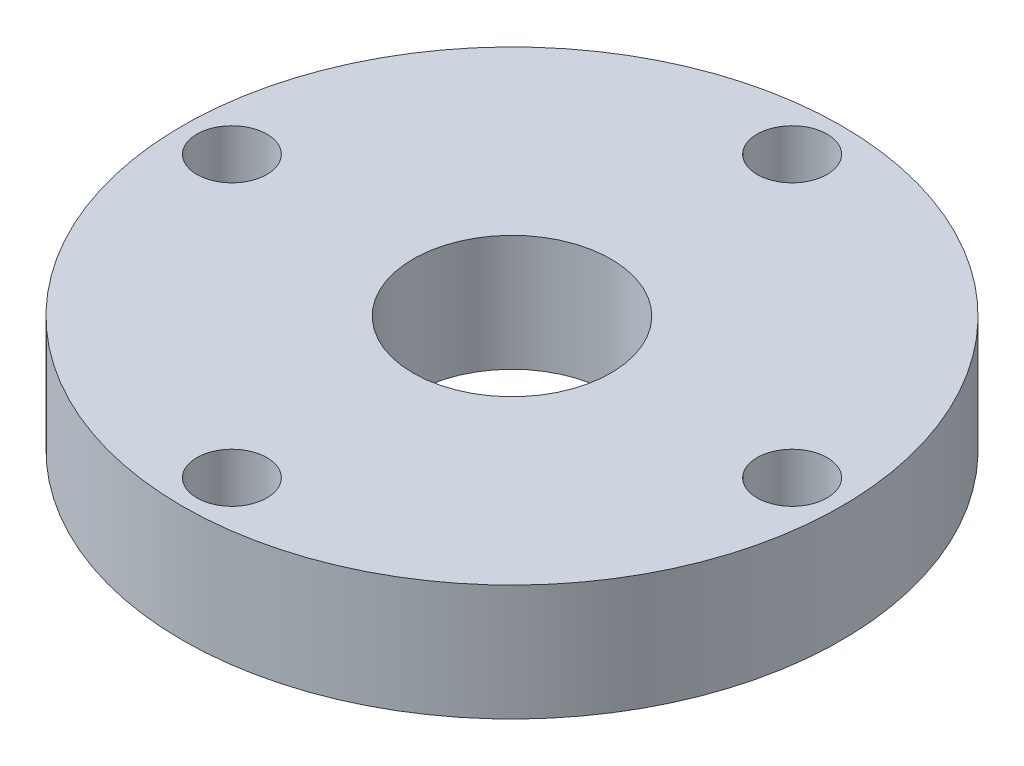
ISO-10303-21;
HEADER;
FILE_DESCRIPTION(('STEP AP214'),'2;1');
FILE_NAME('part.step','',(''),(''),'','','');
FILE_SCHEMA(('AUTOMOTIVE_DESIGN { 1 0 10303 214 1 1 1 1 }'));
ENDSEC;
DATA;
#1=APPLICATION_CONTEXT('core data for automotive mechanical design processes');
#2=APPLICATION_PROTOCOL_DEFINITION('international standard','automotive_design',2000,#1);
#3=PRODUCT_CONTEXT('',#1,'mechanical');
#4=PRODUCT('Part','Part','',(#3));
#5=PRODUCT_RELATED_PRODUCT_CATEGORY('part','',(#4));
#6=PRODUCT_DEFINITION_FORMATION('','',#4);
#7=PRODUCT_DEFINITION_CONTEXT('part definition',#1,'design');
#8=PRODUCT_DEFINITION('design','',#6,#7);
#9=PRODUCT_DEFINITION_SHAPE('','',#8);
#10=(LENGTH_UNIT() NAMED_UNIT(*) SI_UNIT(.MILLI.,.METRE.));
#11=(NAMED_UNIT(*) PLANE_ANGLE_UNIT() SI_UNIT($,.RADIAN.));
#12=(NAMED_UNIT(*) SI_UNIT($,.STERADIAN.) SOLID_ANGLE_UNIT());
#13=UNCERTAINTY_MEASURE_WITH_UNIT(LENGTH_MEASURE(1.E-05),#10,'distance_accuracy_value','');
#14=(GEOMETRIC_REPRESENTATION_CONTEXT(3) GLOBAL_UNCERTAINTY_ASSIGNED_CONTEXT((#13)) GLOBAL_UNIT_ASSIGNED_CONTEXT((#10,
#11,#12)) REPRESENTATION_CONTEXT('',''));
#15=CARTESIAN_POINT('',(0.,0.,0.));
#16=DIRECTION('',(0.,0.,1.));
#17=DIRECTION('',(1.,0.,0.));
#18=AXIS2_PLACEMENT_3D('',#15,#16,#17);
#19=CARTESIAN_POINT('',(0.,-11.176,0.));
#20=DIRECTION('',(0.,1.,0.));
#21=DIRECTION('',(0.,0.,1.));
#22=AXIS2_PLACEMENT_3D('',#19,#20,#21);
#23=PLANE('',#22);
#24=CARTESIAN_POINT('',(0.,-11.176,53.975));
#25=DIRECTION('',(0.,1.,0.));
#26=DIRECTION('',(0.,0.,1.));
#27=AXIS2_PLACEMENT_3D('',#24,#25,#26);
#28=CIRCLE('',#27,4.36879999999999);
#29=CARTESIAN_POINT('',(0.,-11.176,58.3438));
#30=VERTEX_POINT('',#29);
#31=EDGE_CURVE('E96',#30,#30,#28,.T.);
#32=ORIENTED_EDGE('',*,*,#31,.T.);
#33=EDGE_LOOP('',(#32));
#34=FACE_BOUND('',#33,.T.);
#35=CARTESIAN_POINT('',(53.975,-11.176,0.));
#36=DIRECTION('',(0.,1.,0.));
#37=DIRECTION('',(0.,0.,1.));
#38=AXIS2_PLACEMENT_3D('',#35,#36,#37);
#39=CIRCLE('',#38,4.36879999999999);
#40=CARTESIAN_POINT('',(53.975,-11.176,4.36879999999999));
#41=VERTEX_POINT('',#40);
#42=EDGE_CURVE('E84',#41,#41,#39,.T.);
#43=ORIENTED_EDGE('',*,*,#42,.T.);
#44=EDGE_LOOP('',(#43));
#45=FACE_BOUND('',#44,.T.);
#46=CARTESIAN_POINT('',(0.,-11.176,-53.975));
#47=DIRECTION('',(0.,1.,0.));
#48=DIRECTION('',(0.,0.,1.));
#49=AXIS2_PLACEMENT_3D('',#46,#47,#48);
#50=CIRCLE('',#49,4.36879999999999);
#51=CARTESIAN_POINT('',(0.,-11.176,-49.6062));
#52=VERTEX_POINT('',#51);
#53=EDGE_CURVE('E72',#52,#52,#50,.T.);
#54=ORIENTED_EDGE('',*,*,#53,.T.);
#55=EDGE_LOOP('',(#54));
#56=FACE_BOUND('',#55,.T.);
#57=CARTESIAN_POINT('',(-53.975,-11.176,0.));
#58=DIRECTION('',(0.,1.,0.));
#59=DIRECTION('',(0.,0.,1.));
#60=AXIS2_PLACEMENT_3D('',#57,#58,#59);
#61=CIRCLE('',#60,4.36879999999999);
#62=CARTESIAN_POINT('',(-53.975,-11.176,4.36879999999999));
#63=VERTEX_POINT('',#62);
#64=EDGE_CURVE('E59',#63,#63,#61,.T.);
#65=ORIENTED_EDGE('',*,*,#64,.T.);
#66=EDGE_LOOP('',(#65));
#67=FACE_BOUND('',#66,.T.);
#68=CARTESIAN_POINT('',(0.,-11.176,0.));
#69=DIRECTION('',(0.,1.,0.));
#70=DIRECTION('',(0.,0.,1.));
#71=AXIS2_PLACEMENT_3D('',#68,#69,#70);
#72=CIRCLE('',#71,19.05);
#73=CARTESIAN_POINT('',(0.,-11.176,19.05));
#74=VERTEX_POINT('',#73);
#75=EDGE_CURVE('E51',#74,#74,#72,.T.);
#76=ORIENTED_EDGE('',*,*,#75,.T.);
#77=EDGE_LOOP('',(#76));
#78=FACE_BOUND('',#77,.T.);
#79=CARTESIAN_POINT('',(0.,-11.176,0.));
#80=DIRECTION('',(0.,-1.,0.));
#81=DIRECTION('',(0.,0.,-1.));
#82=AXIS2_PLACEMENT_3D('',#79,#80,#81);
#83=CIRCLE('',#82,63.5);
#84=CARTESIAN_POINT('',(0.,-11.176,-63.5));
#85=VERTEX_POINT('',#84);
#86=EDGE_CURVE('E10',#85,#85,#83,.T.);
#87=ORIENTED_EDGE('',*,*,#86,.T.);
#88=EDGE_LOOP('',(#87));
#89=FACE_BOUND('',#88,.T.);
#90=ADVANCED_FACE('F41',(#34,#45,#56,#67,#78,#89),#23,.F.);
#91=CARTESIAN_POINT('',(0.,-36.576,0.));
#92=DIRECTION('',(0.,-1.,0.));
#93=DIRECTION('',(0.,0.,-1.));
#94=AXIS2_PLACEMENT_3D('',#91,#92,#93);
#95=CYLINDRICAL_SURFACE('',#94,63.5);
#96=ORIENTED_EDGE('',*,*,#86,.F.);
#97=EDGE_LOOP('',(#96));
#98=FACE_BOUND('',#97,.T.);
#99=CARTESIAN_POINT('',(0.,11.176,0.));
#100=DIRECTION('',(0.,-1.,0.));
#101=DIRECTION('',(0.,0.,-1.));
#102=AXIS2_PLACEMENT_3D('',#99,#100,#101);
#103=CIRCLE('',#102,63.5);
#104=CARTESIAN_POINT('',(0.,11.176,-63.5));
#105=VERTEX_POINT('',#104);
#106=EDGE_CURVE('E47',#105,#105,#103,.T.);
#107=ORIENTED_EDGE('',*,*,#106,.T.);
#108=EDGE_LOOP('',(#107));
#109=FACE_BOUND('',#108,.T.);
#110=ADVANCED_FACE('F115',(#98,#109),#95,.T.);
#111=CARTESIAN_POINT('',(-63.5,11.176,0.));
#112=DIRECTION('',(0.,-1.,0.));
#113=DIRECTION('',(0.,0.,-1.));
#114=AXIS2_PLACEMENT_3D('',#111,#112,#113);
#115=PLANE('',#114);
#116=CARTESIAN_POINT('',(0.,11.176,53.975));
#117=DIRECTION('',(0.,1.,0.));
#118=DIRECTION('',(0.,0.,1.));
#119=AXIS2_PLACEMENT_3D('',#116,#117,#118);
#120=CIRCLE('',#119,6.7437);
#121=CARTESIAN_POINT('',(0.,11.176,60.7187));
#122=VERTEX_POINT('',#121);
#123=EDGE_CURVE('E105',#122,#122,#120,.T.);
#124=ORIENTED_EDGE('',*,*,#123,.F.);
#125=EDGE_LOOP('',(#124));
#126=FACE_BOUND('',#125,.T.);
#127=CARTESIAN_POINT('',(53.975,11.176,0.));
#128=DIRECTION('',(0.,1.,0.));
#129=DIRECTION('',(0.,0.,1.));
#130=AXIS2_PLACEMENT_3D('',#127,#128,#129);
#131=CIRCLE('',#130,6.74369999999999);
#132=CARTESIAN_POINT('',(53.975,11.176,6.74369999999999));
#133=VERTEX_POINT('',#132);
#134=EDGE_CURVE('E93',#133,#133,#131,.T.);
#135=ORIENTED_EDGE('',*,*,#134,.F.);
#136=EDGE_LOOP('',(#135));
#137=FACE_BOUND('',#136,.T.);
#138=CARTESIAN_POINT('',(0.,11.176,-53.975));
#139=DIRECTION('',(0.,1.,0.));
#140=DIRECTION('',(0.,0.,1.));
#141=AXIS2_PLACEMENT_3D('',#138,#139,#140);
#142=CIRCLE('',#141,6.7437);
#143=CARTESIAN_POINT('',(0.,11.176,-47.2313));
#144=VERTEX_POINT('',#143);
#145=EDGE_CURVE('E81',#144,#144,#142,.T.);
#146=ORIENTED_EDGE('',*,*,#145,.F.);
#147=EDGE_LOOP('',(#146));
#148=FACE_BOUND('',#147,.T.);
#149=CARTESIAN_POINT('',(-53.975,11.176,0.));
#150=DIRECTION('',(0.,1.,0.));
#151=DIRECTION('',(0.,0.,1.));
#152=AXIS2_PLACEMENT_3D('',#149,#150,#151);
#153=CIRCLE('',#152,6.74369999999999);
#154=CARTESIAN_POINT('',(-53.975,11.176,6.74369999999999));
#155=VERTEX_POINT('',#154);
#156=EDGE_CURVE('E69',#155,#155,#153,.T.);
#157=ORIENTED_EDGE('',*,*,#156,.F.);
#158=EDGE_LOOP('',(#157));
#159=FACE_BOUND('',#158,.T.);
#160=CARTESIAN_POINT('',(0.,11.176,0.));
#161=DIRECTION('',(0.,1.,0.));
#162=DIRECTION('',(0.,0.,1.));
#163=AXIS2_PLACEMENT_3D('',#160,#161,#162);
#164=CIRCLE('',#163,19.05);
#165=CARTESIAN_POINT('',(0.,11.176,19.05));
#166=VERTEX_POINT('',#165);
#167=EDGE_CURVE('E55',#166,#166,#164,.T.);
#168=ORIENTED_EDGE('',*,*,#167,.F.);
#169=EDGE_LOOP('',(#168));
#170=FACE_BOUND('',#169,.T.);
#171=ORIENTED_EDGE('',*,*,#106,.F.);
#172=EDGE_LOOP('',(#171));
#173=FACE_BOUND('',#172,.T.);
#174=ADVANCED_FACE('F111',(#126,#137,#148,#159,#170,#173),#115,.F.);
#175=CARTESIAN_POINT('',(0.,-11.176,0.));
#176=DIRECTION('',(0.,1.,0.));
#177=DIRECTION('',(0.,0.,1.));
#178=AXIS2_PLACEMENT_3D('',#175,#176,#177);
#179=CYLINDRICAL_SURFACE('',#178,19.05);
#180=ORIENTED_EDGE('',*,*,#75,.F.);
#181=EDGE_LOOP('',(#180));
#182=FACE_BOUND('',#181,.T.);
#183=ORIENTED_EDGE('',*,*,#167,.T.);
#184=EDGE_LOOP('',(#183));
#185=FACE_BOUND('',#184,.T.);
#186=ADVANCED_FACE('F114',(#182,#185),#179,.F.);
#187=CARTESIAN_POINT('',(-53.975,11.176,0.));
#188=DIRECTION('',(0.,1.,0.));
#189=DIRECTION('',(0.,0.,1.));
#190=AXIS2_PLACEMENT_3D('',#187,#188,#189);
#191=CYLINDRICAL_SURFACE('',#190,4.36879999999999);
#192=ORIENTED_EDGE('',*,*,#64,.F.);
#193=EDGE_LOOP('',(#192));
#194=FACE_BOUND('',#193,.T.);
#195=CARTESIAN_POINT('',(-53.975,1.52400000000001,0.));
#196=DIRECTION('',(0.,1.,0.));
#197=DIRECTION('',(0.,0.,1.));
#198=AXIS2_PLACEMENT_3D('',#195,#196,#197);
#199=CIRCLE('',#198,4.36879999999999);
#200=CARTESIAN_POINT('',(-53.975,1.52400000000001,4.36879999999999));
#201=VERTEX_POINT('',#200);
#202=EDGE_CURVE('E63',#201,#201,#199,.T.);
#203=ORIENTED_EDGE('',*,*,#202,.T.);
#204=EDGE_LOOP('',(#203));
#205=FACE_BOUND('',#204,.T.);
#206=ADVANCED_FACE('F127',(#194,#205),#191,.F.);
#207=CARTESIAN_POINT('',(-49.6062,1.524,0.));
#208=DIRECTION('',(0.,-1.,0.));
#209=DIRECTION('',(0.,0.,-1.));
#210=AXIS2_PLACEMENT_3D('',#207,#208,#209);
#211=PLANE('',#210);
#212=ORIENTED_EDGE('',*,*,#202,.F.);
#213=EDGE_LOOP('',(#212));
#214=FACE_BOUND('',#213,.T.);
#215=CARTESIAN_POINT('',(-53.975,1.524,0.));
#216=DIRECTION('',(0.,1.,0.));
#217=DIRECTION('',(0.,0.,1.));
#218=AXIS2_PLACEMENT_3D('',#215,#216,#217);
#219=CIRCLE('',#218,6.74369999999999);
#220=CARTESIAN_POINT('',(-53.975,1.524,6.74369999999999));
#221=VERTEX_POINT('',#220);
#222=EDGE_CURVE('E66',#221,#221,#219,.T.);
#223=ORIENTED_EDGE('',*,*,#222,.T.);
#224=EDGE_LOOP('',(#223));
#225=FACE_BOUND('',#224,.T.);
#226=ADVANCED_FACE('F134',(#214,#225),#211,.F.);
#227=CARTESIAN_POINT('',(-53.975,11.176,0.));
#228=DIRECTION('',(0.,1.,0.));
#229=DIRECTION('',(0.,0.,1.));
#230=AXIS2_PLACEMENT_3D('',#227,#228,#229);
#231=CYLINDRICAL_SURFACE('',#230,6.74369999999999);
#232=ORIENTED_EDGE('',*,*,#222,.F.);
#233=EDGE_LOOP('',(#232));
#234=FACE_BOUND('',#233,.T.);
#235=ORIENTED_EDGE('',*,*,#156,.T.);
#236=EDGE_LOOP('',(#235));
#237=FACE_BOUND('',#236,.T.);
#238=ADVANCED_FACE('F157',(#234,#237),#231,.F.);
#239=CARTESIAN_POINT('',(0.,11.176,-53.975));
#240=DIRECTION('',(0.,1.,0.));
#241=DIRECTION('',(0.,0.,1.));
#242=AXIS2_PLACEMENT_3D('',#239,#240,#241);
#243=CYLINDRICAL_SURFACE('',#242,4.36879999999999);
#244=ORIENTED_EDGE('',*,*,#53,.F.);
#245=EDGE_LOOP('',(#244));
#246=FACE_BOUND('',#245,.T.);
#247=CARTESIAN_POINT('',(0.,1.52400000000001,-53.975));
#248=DIRECTION('',(0.,1.,0.));
#249=DIRECTION('',(0.,0.,1.));
#250=AXIS2_PLACEMENT_3D('',#247,#248,#249);
#251=CIRCLE('',#250,4.36879999999999);
#252=CARTESIAN_POINT('',(0.,1.52400000000001,-49.6062));
#253=VERTEX_POINT('',#252);
#254=EDGE_CURVE('E75',#253,#253,#251,.T.);
#255=ORIENTED_EDGE('',*,*,#254,.T.);
#256=EDGE_LOOP('',(#255));
#257=FACE_BOUND('',#256,.T.);
#258=ADVANCED_FACE('F162',(#246,#257),#243,.F.);
#259=CARTESIAN_POINT('',(4.36879999999999,1.524,-53.975));
#260=DIRECTION('',(0.,-1.,0.));
#261=DIRECTION('',(0.,0.,-1.));
#262=AXIS2_PLACEMENT_3D('',#259,#260,#261);
#263=PLANE('',#262);
#264=ORIENTED_EDGE('',*,*,#254,.F.);
#265=EDGE_LOOP('',(#264));
#266=FACE_BOUND('',#265,.T.);
#267=CARTESIAN_POINT('',(0.,1.524,-53.975));
#268=DIRECTION('',(0.,1.,0.));
#269=DIRECTION('',(0.,0.,1.));
#270=AXIS2_PLACEMENT_3D('',#267,#268,#269);
#271=CIRCLE('',#270,6.7437);
#272=CARTESIAN_POINT('',(0.,1.524,-47.2313));
#273=VERTEX_POINT('',#272);
#274=EDGE_CURVE('E78',#273,#273,#271,.T.);
#275=ORIENTED_EDGE('',*,*,#274,.T.);
#276=EDGE_LOOP('',(#275));
#277=FACE_BOUND('',#276,.T.);
#278=ADVANCED_FACE('F167',(#266,#277),#263,.F.);
#279=CARTESIAN_POINT('',(0.,11.176,-53.975));
#280=DIRECTION('',(0.,1.,0.));
#281=DIRECTION('',(0.,0.,1.));
#282=AXIS2_PLACEMENT_3D('',#279,#280,#281);
#283=CYLINDRICAL_SURFACE('',#282,6.7437);
#284=ORIENTED_EDGE('',*,*,#274,.F.);
#285=EDGE_LOOP('',(#284));
#286=FACE_BOUND('',#285,.T.);
#287=ORIENTED_EDGE('',*,*,#145,.T.);
#288=EDGE_LOOP('',(#287));
#289=FACE_BOUND('',#288,.T.);
#290=ADVANCED_FACE('F173',(#286,#289),#283,.F.);
#291=CARTESIAN_POINT('',(53.975,11.176,0.));
#292=DIRECTION('',(0.,1.,0.));
#293=DIRECTION('',(0.,0.,1.));
#294=AXIS2_PLACEMENT_3D('',#291,#292,#293);
#295=CYLINDRICAL_SURFACE('',#294,4.36879999999999);
#296=ORIENTED_EDGE('',*,*,#42,.F.);
#297=EDGE_LOOP('',(#296));
#298=FACE_BOUND('',#297,.T.);
#299=CARTESIAN_POINT('',(53.975,1.52400000000001,0.));
#300=DIRECTION('',(0.,1.,0.));
#301=DIRECTION('',(0.,0.,1.));
#302=AXIS2_PLACEMENT_3D('',#299,#300,#301);
#303=CIRCLE('',#302,4.36879999999999);
#304=CARTESIAN_POINT('',(53.975,1.52400000000001,4.36879999999999));
#305=VERTEX_POINT('',#304);
#306=EDGE_CURVE('E87',#305,#305,#303,.T.);
#307=ORIENTED_EDGE('',*,*,#306,.T.);
#308=EDGE_LOOP('',(#307));
#309=FACE_BOUND('',#308,.T.);
#310=ADVANCED_FACE('F177',(#298,#309),#295,.F.);
#311=CARTESIAN_POINT('',(58.3438,1.524,0.));
#312=DIRECTION('',(0.,-1.,0.));
#313=DIRECTION('',(0.,0.,-1.));
#314=AXIS2_PLACEMENT_3D('',#311,#312,#313);
#315=PLANE('',#314);
#316=ORIENTED_EDGE('',*,*,#306,.F.);
#317=EDGE_LOOP('',(#316));
#318=FACE_BOUND('',#317,.T.);
#319=CARTESIAN_POINT('',(53.975,1.524,0.));
#320=DIRECTION('',(0.,1.,0.));
#321=DIRECTION('',(0.,0.,1.));
#322=AXIS2_PLACEMENT_3D('',#319,#320,#321);
#323=CIRCLE('',#322,6.74369999999999);
#324=CARTESIAN_POINT('',(53.975,1.524,6.74369999999999));
#325=VERTEX_POINT('',#324);
#326=EDGE_CURVE('E90',#325,#325,#323,.T.);
#327=ORIENTED_EDGE('',*,*,#326,.T.);
#328=EDGE_LOOP('',(#327));
#329=FACE_BOUND('',#328,.T.);
#330=ADVANCED_FACE('F181',(#318,#329),#315,.F.);
#331=CARTESIAN_POINT('',(53.975,11.176,0.));
#332=DIRECTION('',(0.,1.,0.));
#333=DIRECTION('',(0.,0.,1.));
#334=AXIS2_PLACEMENT_3D('',#331,#332,#333);
#335=CYLINDRICAL_SURFACE('',#334,6.74369999999999);
#336=ORIENTED_EDGE('',*,*,#326,.F.);
#337=EDGE_LOOP('',(#336));
#338=FACE_BOUND('',#337,.T.);
#339=ORIENTED_EDGE('',*,*,#134,.T.);
#340=EDGE_LOOP('',(#339));
#341=FACE_BOUND('',#340,.T.);
#342=ADVANCED_FACE('F185',(#338,#341),#335,.F.);
#343=CARTESIAN_POINT('',(0.,11.176,53.975));
#344=DIRECTION('',(0.,1.,0.));
#345=DIRECTION('',(0.,0.,1.));
#346=AXIS2_PLACEMENT_3D('',#343,#344,#345);
#347=CYLINDRICAL_SURFACE('',#346,4.36879999999999);
#348=ORIENTED_EDGE('',*,*,#31,.F.);
#349=EDGE_LOOP('',(#348));
#350=FACE_BOUND('',#349,.T.);
#351=CARTESIAN_POINT('',(0.,1.52400000000001,53.975));
#352=DIRECTION('',(0.,1.,0.));
#353=DIRECTION('',(0.,0.,1.));
#354=AXIS2_PLACEMENT_3D('',#351,#352,#353);
#355=CIRCLE('',#354,4.36879999999999);
#356=CARTESIAN_POINT('',(0.,1.52400000000001,58.3438));
#357=VERTEX_POINT('',#356);
#358=EDGE_CURVE('E99',#357,#357,#355,.T.);
#359=ORIENTED_EDGE('',*,*,#358,.T.);
#360=EDGE_LOOP('',(#359));
#361=FACE_BOUND('',#360,.T.);
#362=ADVANCED_FACE('F189',(#350,#361),#347,.F.);
#363=CARTESIAN_POINT('',(4.36879999999999,1.524,53.975));
#364=DIRECTION('',(0.,-1.,0.));
#365=DIRECTION('',(0.,0.,-1.));
#366=AXIS2_PLACEMENT_3D('',#363,#364,#365);
#367=PLANE('',#366);
#368=ORIENTED_EDGE('',*,*,#358,.F.);
#369=EDGE_LOOP('',(#368));
#370=FACE_BOUND('',#369,.T.);
#371=CARTESIAN_POINT('',(0.,1.524,53.975));
#372=DIRECTION('',(0.,1.,0.));
#373=DIRECTION('',(0.,0.,1.));
#374=AXIS2_PLACEMENT_3D('',#371,#372,#373);
#375=CIRCLE('',#374,6.7437);
#376=CARTESIAN_POINT('',(0.,1.524,60.7187));
#377=VERTEX_POINT('',#376);
#378=EDGE_CURVE('E102',#377,#377,#375,.T.);
#379=ORIENTED_EDGE('',*,*,#378,.T.);
#380=EDGE_LOOP('',(#379));
#381=FACE_BOUND('',#380,.T.);
#382=ADVANCED_FACE('F193',(#370,#381),#367,.F.);
#383=CARTESIAN_POINT('',(0.,11.176,53.975));
#384=DIRECTION('',(0.,1.,0.));
#385=DIRECTION('',(0.,0.,1.));
#386=AXIS2_PLACEMENT_3D('',#383,#384,#385);
#387=CYLINDRICAL_SURFACE('',#386,6.7437);
#388=ORIENTED_EDGE('',*,*,#378,.F.);
#389=EDGE_LOOP('',(#388));
#390=FACE_BOUND('',#389,.T.);
#391=ORIENTED_EDGE('',*,*,#123,.T.);
#392=EDGE_LOOP('',(#391));
#393=FACE_BOUND('',#392,.T.);
#394=ADVANCED_FACE('F109',(#390,#393),#387,.F.);
#395=CLOSED_SHELL('',(#90,#110,#174,#186,#206,#226,#238,#258,#278,#290,#310,#330,#342,#362,#382,#394));
#396=MANIFOLD_SOLID_BREP('B2',#395);
#397=ADVANCED_BREP_SHAPE_REPRESENTATION('',(#18,#396),#14);
#398=SHAPE_DEFINITION_REPRESENTATION(#9,#397);
ENDSEC;
END-ISO-10303-21;
